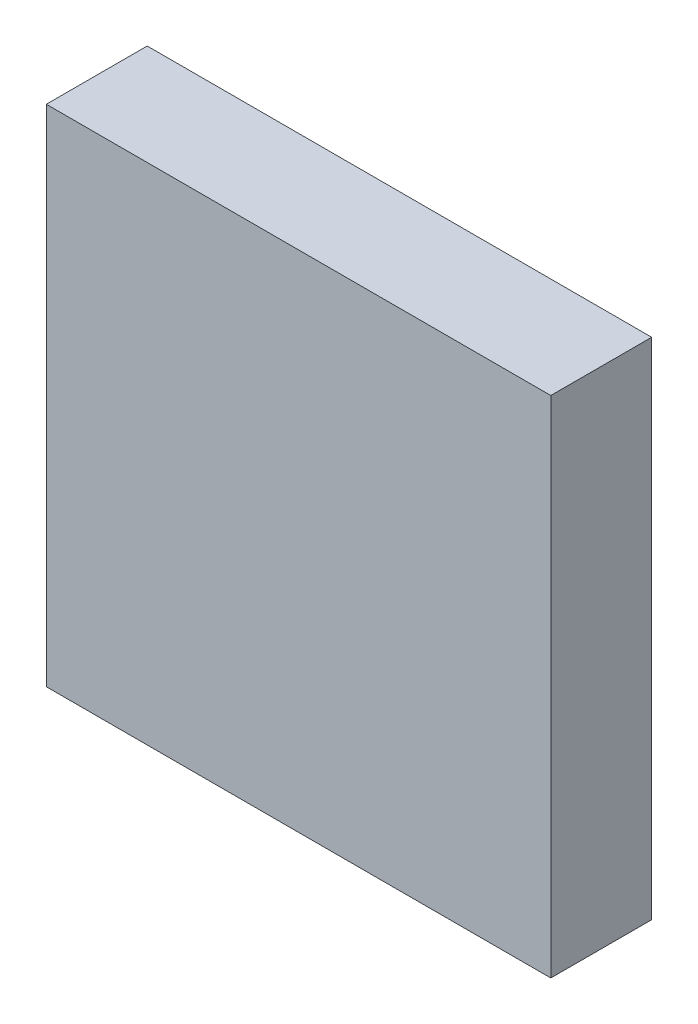
ISO-10303-21;
HEADER;
FILE_DESCRIPTION(('STEP AP214'),'2;1');
FILE_NAME('part.step','',(''),(''),'','','');
FILE_SCHEMA(('AUTOMOTIVE_DESIGN { 1 0 10303 214 1 1 1 1 }'));
ENDSEC;
DATA;
#1=APPLICATION_CONTEXT('core data for automotive mechanical design processes');
#2=APPLICATION_PROTOCOL_DEFINITION('international standard','automotive_design',2000,#1);
#3=PRODUCT_CONTEXT('',#1,'mechanical');
#4=PRODUCT('Part','Part','',(#3));
#5=PRODUCT_RELATED_PRODUCT_CATEGORY('part','',(#4));
#6=PRODUCT_DEFINITION_FORMATION('','',#4);
#7=PRODUCT_DEFINITION_CONTEXT('part definition',#1,'design');
#8=PRODUCT_DEFINITION('design','',#6,#7);
#9=PRODUCT_DEFINITION_SHAPE('','',#8);
#10=(LENGTH_UNIT() NAMED_UNIT(*) SI_UNIT(.MILLI.,.METRE.));
#11=(NAMED_UNIT(*) PLANE_ANGLE_UNIT() SI_UNIT($,.RADIAN.));
#12=(NAMED_UNIT(*) SI_UNIT($,.STERADIAN.) SOLID_ANGLE_UNIT());
#13=UNCERTAINTY_MEASURE_WITH_UNIT(LENGTH_MEASURE(1.E-05),#10,'distance_accuracy_value','');
#14=(GEOMETRIC_REPRESENTATION_CONTEXT(3) GLOBAL_UNCERTAINTY_ASSIGNED_CONTEXT((#13)) GLOBAL_UNIT_ASSIGNED_CONTEXT((#10,
#11,#12)) REPRESENTATION_CONTEXT('',''));
#15=CARTESIAN_POINT('',(0.,0.,0.));
#16=DIRECTION('',(0.,0.,1.));
#17=DIRECTION('',(1.,0.,0.));
#18=AXIS2_PLACEMENT_3D('',#15,#16,#17);
#19=CARTESIAN_POINT('',(0.,0.,4.));
#20=DIRECTION('',(1.,0.,0.));
#21=DIRECTION('',(0.,0.,-1.));
#22=AXIS2_PLACEMENT_3D('',#19,#20,#21);
#23=PLANE('',#22);
#24=DIRECTION('',(0.,-1.,0.));
#25=VECTOR('',#24,1.);
#26=CARTESIAN_POINT('',(0.,0.,0.));
#27=LINE('',#26,#25);
#28=CARTESIAN_POINT('',(0.,20.,0.));
#29=VERTEX_POINT('',#28);
#30=CARTESIAN_POINT('',(0.,0.,0.));
#31=VERTEX_POINT('',#30);
#32=EDGE_CURVE('E107',#29,#31,#27,.T.);
#33=ORIENTED_EDGE('',*,*,#32,.T.);
#34=DIRECTION('',(0.,0.,-1.));
#35=VECTOR('',#34,1.);
#36=CARTESIAN_POINT('',(0.,0.,4.));
#37=LINE('',#36,#35);
#38=CARTESIAN_POINT('',(0.,0.,4.));
#39=VERTEX_POINT('',#38);
#40=EDGE_CURVE('E11',#39,#31,#37,.T.);
#41=ORIENTED_EDGE('',*,*,#40,.F.);
#42=DIRECTION('',(0.,-1.,0.));
#43=VECTOR('',#42,1.);
#44=CARTESIAN_POINT('',(0.,0.,4.));
#45=LINE('',#44,#43);
#46=CARTESIAN_POINT('',(0.,20.,4.));
#47=VERTEX_POINT('',#46);
#48=EDGE_CURVE('E91',#47,#39,#45,.T.);
#49=ORIENTED_EDGE('',*,*,#48,.F.);
#50=DIRECTION('',(0.,0.,-1.));
#51=VECTOR('',#50,1.);
#52=CARTESIAN_POINT('',(0.,20.,4.));
#53=LINE('',#52,#51);
#54=EDGE_CURVE('E103',#47,#29,#53,.T.);
#55=ORIENTED_EDGE('',*,*,#54,.T.);
#56=EDGE_LOOP('',(#33,#41,#49,#55));
#57=FACE_BOUND('',#56,.T.);
#58=ADVANCED_FACE('F39',(#57),#23,.F.);
#59=CARTESIAN_POINT('',(0.,0.,4.));
#60=DIRECTION('',(0.,1.,0.));
#61=DIRECTION('',(0.,0.,1.));
#62=AXIS2_PLACEMENT_3D('',#59,#60,#61);
#63=PLANE('',#62);
#64=DIRECTION('',(1.,0.,0.));
#65=VECTOR('',#64,1.);
#66=CARTESIAN_POINT('',(0.,0.,0.));
#67=LINE('',#66,#65);
#68=CARTESIAN_POINT('',(20.,0.,0.));
#69=VERTEX_POINT('',#68);
#70=EDGE_CURVE('E96',#31,#69,#67,.T.);
#71=ORIENTED_EDGE('',*,*,#70,.T.);
#72=DIRECTION('',(0.,0.,-1.));
#73=VECTOR('',#72,1.);
#74=CARTESIAN_POINT('',(20.,0.,4.));
#75=LINE('',#74,#73);
#76=CARTESIAN_POINT('',(20.,0.,4.));
#77=VERTEX_POINT('',#76);
#78=EDGE_CURVE('E48',#77,#69,#75,.T.);
#79=ORIENTED_EDGE('',*,*,#78,.F.);
#80=DIRECTION('',(1.,0.,0.));
#81=VECTOR('',#80,1.);
#82=CARTESIAN_POINT('',(0.,0.,4.));
#83=LINE('',#82,#81);
#84=EDGE_CURVE('E86',#39,#77,#83,.T.);
#85=ORIENTED_EDGE('',*,*,#84,.F.);
#86=ORIENTED_EDGE('',*,*,#40,.T.);
#87=EDGE_LOOP('',(#71,#79,#85,#86));
#88=FACE_BOUND('',#87,.T.);
#89=ADVANCED_FACE('F95',(#88),#63,.F.);
#90=CARTESIAN_POINT('',(20.,0.,4.));
#91=DIRECTION('',(-1.,0.,0.));
#92=DIRECTION('',(0.,0.,1.));
#93=AXIS2_PLACEMENT_3D('',#90,#91,#92);
#94=PLANE('',#93);
#95=DIRECTION('',(0.,1.,0.));
#96=VECTOR('',#95,1.);
#97=CARTESIAN_POINT('',(20.,0.,0.));
#98=LINE('',#97,#96);
#99=CARTESIAN_POINT('',(20.,20.,0.));
#100=VERTEX_POINT('',#99);
#101=EDGE_CURVE('E73',#69,#100,#98,.T.);
#102=ORIENTED_EDGE('',*,*,#101,.T.);
#103=DIRECTION('',(0.,0.,-1.));
#104=VECTOR('',#103,1.);
#105=CARTESIAN_POINT('',(20.,20.,4.));
#106=LINE('',#105,#104);
#107=CARTESIAN_POINT('',(20.,20.,4.));
#108=VERTEX_POINT('',#107);
#109=EDGE_CURVE('E98',#108,#100,#106,.T.);
#110=ORIENTED_EDGE('',*,*,#109,.F.);
#111=DIRECTION('',(0.,1.,0.));
#112=VECTOR('',#111,1.);
#113=CARTESIAN_POINT('',(20.,0.,4.));
#114=LINE('',#113,#112);
#115=EDGE_CURVE('E89',#77,#108,#114,.T.);
#116=ORIENTED_EDGE('',*,*,#115,.F.);
#117=ORIENTED_EDGE('',*,*,#78,.T.);
#118=EDGE_LOOP('',(#102,#110,#116,#117));
#119=FACE_BOUND('',#118,.T.);
#120=ADVANCED_FACE('F99',(#119),#94,.F.);
#121=CARTESIAN_POINT('',(0.,20.,4.));
#122=DIRECTION('',(0.,-1.,0.));
#123=DIRECTION('',(0.,0.,-1.));
#124=AXIS2_PLACEMENT_3D('',#121,#122,#123);
#125=PLANE('',#124);
#126=DIRECTION('',(-1.,0.,0.));
#127=VECTOR('',#126,1.);
#128=CARTESIAN_POINT('',(0.,20.,0.));
#129=LINE('',#128,#127);
#130=EDGE_CURVE('E79',#100,#29,#129,.T.);
#131=ORIENTED_EDGE('',*,*,#130,.T.);
#132=ORIENTED_EDGE('',*,*,#54,.F.);
#133=DIRECTION('',(-1.,0.,0.));
#134=VECTOR('',#133,1.);
#135=CARTESIAN_POINT('',(0.,20.,4.));
#136=LINE('',#135,#134);
#137=EDGE_CURVE('E56',#108,#47,#136,.T.);
#138=ORIENTED_EDGE('',*,*,#137,.F.);
#139=ORIENTED_EDGE('',*,*,#109,.T.);
#140=EDGE_LOOP('',(#131,#132,#138,#139));
#141=FACE_BOUND('',#140,.T.);
#142=ADVANCED_FACE('F120',(#141),#125,.F.);
#143=CARTESIAN_POINT('',(0.,0.,4.));
#144=DIRECTION('',(0.,0.,-1.));
#145=DIRECTION('',(-1.,0.,0.));
#146=AXIS2_PLACEMENT_3D('',#143,#144,#145);
#147=PLANE('',#146);
#148=ORIENTED_EDGE('',*,*,#48,.T.);
#149=ORIENTED_EDGE('',*,*,#84,.T.);
#150=ORIENTED_EDGE('',*,*,#115,.T.);
#151=ORIENTED_EDGE('',*,*,#137,.T.);
#152=EDGE_LOOP('',(#148,#149,#150,#151));
#153=FACE_BOUND('',#152,.T.);
#154=ADVANCED_FACE('F87',(#153),#147,.F.);
#155=CARTESIAN_POINT('',(0.,0.,0.));
#156=DIRECTION('',(0.,0.,-1.));
#157=DIRECTION('',(-1.,0.,0.));
#158=AXIS2_PLACEMENT_3D('',#155,#156,#157);
#159=PLANE('',#158);
#160=ORIENTED_EDGE('',*,*,#32,.F.);
#161=ORIENTED_EDGE('',*,*,#130,.F.);
#162=ORIENTED_EDGE('',*,*,#101,.F.);
#163=ORIENTED_EDGE('',*,*,#70,.F.);
#164=EDGE_LOOP('',(#160,#161,#162,#163));
#165=FACE_BOUND('',#164,.T.);
#166=ADVANCED_FACE('F123',(#165),#159,.T.);
#167=CLOSED_SHELL('',(#58,#89,#120,#142,#154,#166));
#168=MANIFOLD_SOLID_BREP('B2',#167);
#169=ADVANCED_BREP_SHAPE_REPRESENTATION('',(#18,#168),#14);
#170=SHAPE_DEFINITION_REPRESENTATION(#9,#169);
ENDSEC;
END-ISO-10303-21;
